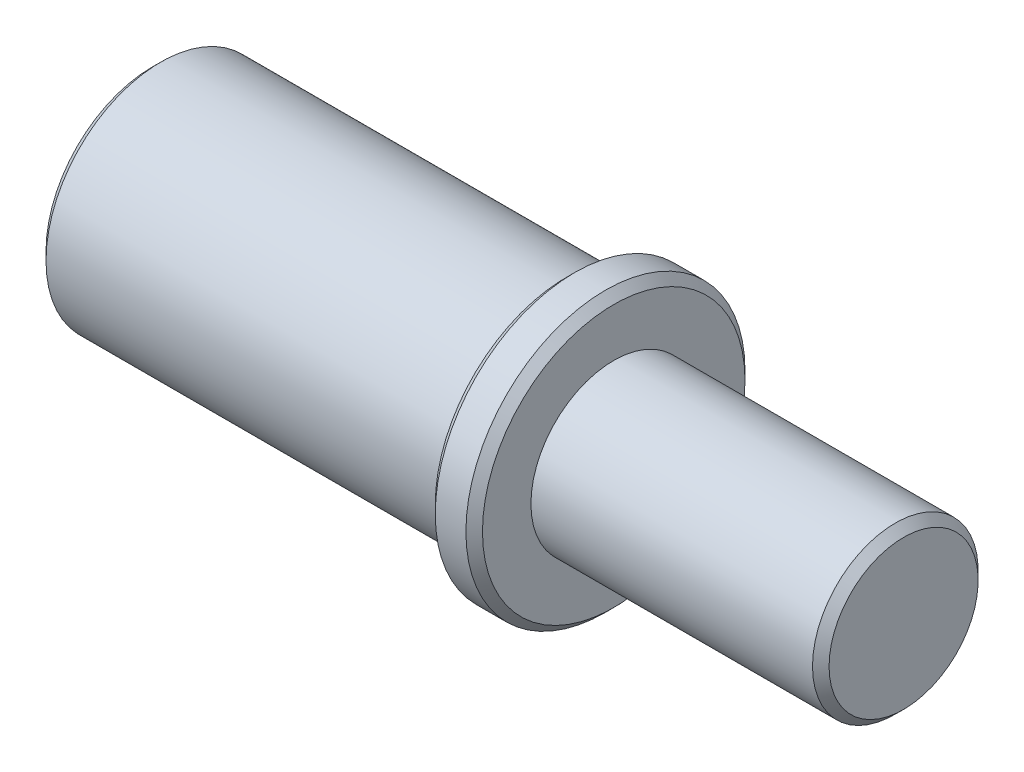
ISO-10303-21;
HEADER;
FILE_DESCRIPTION(('STEP AP214'),'2;1');
FILE_NAME('part.step','',(''),(''),'','','');
FILE_SCHEMA(('AUTOMOTIVE_DESIGN { 1 0 10303 214 1 1 1 1 }'));
ENDSEC;
DATA;
#1=APPLICATION_CONTEXT('core data for automotive mechanical design processes');
#2=APPLICATION_PROTOCOL_DEFINITION('international standard','automotive_design',2000,#1);
#3=PRODUCT_CONTEXT('',#1,'mechanical');
#4=PRODUCT('Part','Part','',(#3));
#5=PRODUCT_RELATED_PRODUCT_CATEGORY('part','',(#4));
#6=PRODUCT_DEFINITION_FORMATION('','',#4);
#7=PRODUCT_DEFINITION_CONTEXT('part definition',#1,'design');
#8=PRODUCT_DEFINITION('design','',#6,#7);
#9=PRODUCT_DEFINITION_SHAPE('','',#8);
#10=(LENGTH_UNIT() NAMED_UNIT(*) SI_UNIT(.MILLI.,.METRE.));
#11=(NAMED_UNIT(*) PLANE_ANGLE_UNIT() SI_UNIT($,.RADIAN.));
#12=(NAMED_UNIT(*) SI_UNIT($,.STERADIAN.) SOLID_ANGLE_UNIT());
#13=UNCERTAINTY_MEASURE_WITH_UNIT(LENGTH_MEASURE(1.E-05),#10,'distance_accuracy_value','');
#14=(GEOMETRIC_REPRESENTATION_CONTEXT(3) GLOBAL_UNCERTAINTY_ASSIGNED_CONTEXT((#13)) GLOBAL_UNIT_ASSIGNED_CONTEXT((#10,
#11,#12)) REPRESENTATION_CONTEXT('',''));
#15=CARTESIAN_POINT('',(0.,0.,0.));
#16=DIRECTION('',(0.,0.,1.));
#17=DIRECTION('',(1.,0.,0.));
#18=AXIS2_PLACEMENT_3D('',#15,#16,#17);
#19=CARTESIAN_POINT('',(0.,0.,0.));
#20=DIRECTION('',(1.,0.,0.));
#21=DIRECTION('',(0.,0.,-1.));
#22=AXIS2_PLACEMENT_3D('',#19,#20,#21);
#23=PLANE('',#22);
#24=CARTESIAN_POINT('',(0.,0.,0.));
#25=DIRECTION('',(1.,0.,0.));
#26=DIRECTION('',(0.,0.,-1.));
#27=AXIS2_PLACEMENT_3D('',#24,#25,#26);
#28=CIRCLE('',#27,12.85);
#29=CARTESIAN_POINT('',(0.,0.,-12.85));
#30=VERTEX_POINT('',#29);
#31=EDGE_CURVE('E84',#30,#30,#28,.F.);
#32=ORIENTED_EDGE('',*,*,#31,.T.);
#33=EDGE_LOOP('',(#32));
#34=FACE_BOUND('',#33,.T.);
#35=ADVANCED_FACE('F45',(#34),#23,.F.);
#36=CARTESIAN_POINT('',(0.,0.,0.));
#37=DIRECTION('',(-1.,0.,0.));
#38=DIRECTION('',(0.,0.,1.));
#39=AXIS2_PLACEMENT_3D('',#36,#37,#38);
#40=CYLINDRICAL_SURFACE('',#39,13.85);
#41=CARTESIAN_POINT('',(0.999999999999992,0.,0.));
#42=DIRECTION('',(1.,0.,0.));
#43=DIRECTION('',(0.,0.,-1.));
#44=AXIS2_PLACEMENT_3D('',#41,#42,#43);
#45=CIRCLE('',#44,13.85);
#46=CARTESIAN_POINT('',(0.999999999999992,0.,-13.85));
#47=VERTEX_POINT('',#46);
#48=EDGE_CURVE('E80',#47,#47,#45,.T.);
#49=ORIENTED_EDGE('',*,*,#48,.T.);
#50=EDGE_LOOP('',(#49));
#51=FACE_BOUND('',#50,.T.);
#52=CARTESIAN_POINT('',(50.,0.,0.));
#53=DIRECTION('',(-1.,0.,0.));
#54=DIRECTION('',(0.,0.,1.));
#55=AXIS2_PLACEMENT_3D('',#52,#53,#54);
#56=CIRCLE('',#55,13.85);
#57=CARTESIAN_POINT('',(50.,0.,13.85));
#58=VERTEX_POINT('',#57);
#59=EDGE_CURVE('E88',#58,#58,#56,.T.);
#60=ORIENTED_EDGE('',*,*,#59,.T.);
#61=EDGE_LOOP('',(#60));
#62=FACE_BOUND('',#61,.T.);
#63=ADVANCED_FACE('F115',(#51,#62),#40,.T.);
#64=CARTESIAN_POINT('',(50.,13.85,0.));
#65=DIRECTION('',(1.,0.,0.));
#66=DIRECTION('',(0.,0.,-1.));
#67=AXIS2_PLACEMENT_3D('',#64,#65,#66);
#68=PLANE('',#67);
#69=CARTESIAN_POINT('',(50.,0.,0.));
#70=DIRECTION('',(1.,0.,0.));
#71=DIRECTION('',(0.,0.,-1.));
#72=AXIS2_PLACEMENT_3D('',#69,#70,#71);
#73=CIRCLE('',#72,15.85);
#74=CARTESIAN_POINT('',(50.,0.,-15.85));
#75=VERTEX_POINT('',#74);
#76=EDGE_CURVE('E66',#75,#75,#73,.F.);
#77=ORIENTED_EDGE('',*,*,#76,.T.);
#78=EDGE_LOOP('',(#77));
#79=FACE_BOUND('',#78,.T.);
#80=ORIENTED_EDGE('',*,*,#59,.F.);
#81=EDGE_LOOP('',(#80));
#82=FACE_BOUND('',#81,.T.);
#83=ADVANCED_FACE('F121',(#79,#82),#68,.F.);
#84=CARTESIAN_POINT('',(0.,0.,0.));
#85=DIRECTION('',(-1.,0.,0.));
#86=DIRECTION('',(0.,0.,1.));
#87=AXIS2_PLACEMENT_3D('',#84,#85,#86);
#88=CYLINDRICAL_SURFACE('',#87,16.85);
#89=CARTESIAN_POINT('',(51.,0.,0.));
#90=DIRECTION('',(1.,0.,0.));
#91=DIRECTION('',(0.,0.,-1.));
#92=AXIS2_PLACEMENT_3D('',#89,#90,#91);
#93=CIRCLE('',#92,16.85);
#94=CARTESIAN_POINT('',(51.,0.,-16.85));
#95=VERTEX_POINT('',#94);
#96=EDGE_CURVE('E54',#95,#95,#93,.T.);
#97=ORIENTED_EDGE('',*,*,#96,.T.);
#98=EDGE_LOOP('',(#97));
#99=FACE_BOUND('',#98,.T.);
#100=CARTESIAN_POINT('',(54.7,0.,0.));
#101=DIRECTION('',(-1.,0.,0.));
#102=DIRECTION('',(0.,0.,1.));
#103=AXIS2_PLACEMENT_3D('',#100,#101,#102);
#104=CIRCLE('',#103,16.85);
#105=CARTESIAN_POINT('',(54.7,0.,16.85));
#106=VERTEX_POINT('',#105);
#107=EDGE_CURVE('E60',#106,#106,#104,.T.);
#108=ORIENTED_EDGE('',*,*,#107,.T.);
#109=EDGE_LOOP('',(#108));
#110=FACE_BOUND('',#109,.T.);
#111=ADVANCED_FACE('F112',(#99,#110),#88,.T.);
#112=CARTESIAN_POINT('',(55.7,16.85,0.));
#113=DIRECTION('',(-1.,0.,0.));
#114=DIRECTION('',(0.,0.,1.));
#115=AXIS2_PLACEMENT_3D('',#112,#113,#114);
#116=PLANE('',#115);
#117=CARTESIAN_POINT('',(55.7,0.,0.));
#118=DIRECTION('',(-1.,0.,0.));
#119=DIRECTION('',(0.,0.,1.));
#120=AXIS2_PLACEMENT_3D('',#117,#118,#119);
#121=CIRCLE('',#120,15.85);
#122=CARTESIAN_POINT('',(55.7,0.,15.85));
#123=VERTEX_POINT('',#122);
#124=EDGE_CURVE('E10',#123,#123,#121,.F.);
#125=ORIENTED_EDGE('',*,*,#124,.T.);
#126=EDGE_LOOP('',(#125));
#127=FACE_BOUND('',#126,.T.);
#128=CARTESIAN_POINT('',(55.7,0.,0.));
#129=DIRECTION('',(-1.,0.,0.));
#130=DIRECTION('',(0.,0.,1.));
#131=AXIS2_PLACEMENT_3D('',#128,#129,#130);
#132=CIRCLE('',#131,10.);
#133=CARTESIAN_POINT('',(55.7,0.,10.));
#134=VERTEX_POINT('',#133);
#135=EDGE_CURVE('E92',#134,#134,#132,.T.);
#136=ORIENTED_EDGE('',*,*,#135,.T.);
#137=EDGE_LOOP('',(#136));
#138=FACE_BOUND('',#137,.T.);
#139=ADVANCED_FACE('F98',(#127,#138),#116,.F.);
#140=CARTESIAN_POINT('',(0.,0.,0.));
#141=DIRECTION('',(-1.,0.,0.));
#142=DIRECTION('',(0.,0.,1.));
#143=AXIS2_PLACEMENT_3D('',#140,#141,#142);
#144=CYLINDRICAL_SURFACE('',#143,10.);
#145=CARTESIAN_POINT('',(89.7,0.,0.));
#146=DIRECTION('',(-1.,0.,0.));
#147=DIRECTION('',(0.,0.,1.));
#148=AXIS2_PLACEMENT_3D('',#145,#146,#147);
#149=CIRCLE('',#148,10.);
#150=CARTESIAN_POINT('',(89.7,0.,10.));
#151=VERTEX_POINT('',#150);
#152=EDGE_CURVE('E76',#151,#151,#149,.T.);
#153=ORIENTED_EDGE('',*,*,#152,.T.);
#154=EDGE_LOOP('',(#153));
#155=FACE_BOUND('',#154,.T.);
#156=ORIENTED_EDGE('',*,*,#135,.F.);
#157=EDGE_LOOP('',(#156));
#158=FACE_BOUND('',#157,.T.);
#159=ADVANCED_FACE('F100',(#155,#158),#144,.T.);
#160=CARTESIAN_POINT('',(90.7,10.,0.));
#161=DIRECTION('',(-1.,0.,0.));
#162=DIRECTION('',(0.,0.,1.));
#163=AXIS2_PLACEMENT_3D('',#160,#161,#162);
#164=PLANE('',#163);
#165=CARTESIAN_POINT('',(90.7,0.,0.));
#166=DIRECTION('',(-1.,0.,0.));
#167=DIRECTION('',(0.,0.,1.));
#168=AXIS2_PLACEMENT_3D('',#165,#166,#167);
#169=CIRCLE('',#168,8.99999999999997);
#170=CARTESIAN_POINT('',(90.7,0.,8.99999999999997));
#171=VERTEX_POINT('',#170);
#172=EDGE_CURVE('E72',#171,#171,#169,.F.);
#173=ORIENTED_EDGE('',*,*,#172,.T.);
#174=EDGE_LOOP('',(#173));
#175=FACE_BOUND('',#174,.T.);
#176=ADVANCED_FACE('F102',(#175),#164,.F.);
#177=CARTESIAN_POINT('',(0.,0.,0.));
#178=DIRECTION('',(1.,0.,0.));
#179=DIRECTION('',(0.,0.,-1.));
#180=AXIS2_PLACEMENT_3D('',#177,#178,#179);
#181=CONICAL_SURFACE('',#180,12.85,0.785398163397445);
#182=ORIENTED_EDGE('',*,*,#48,.F.);
#183=EDGE_LOOP('',(#182));
#184=FACE_BOUND('',#183,.T.);
#185=ORIENTED_EDGE('',*,*,#31,.F.);
#186=EDGE_LOOP('',(#185));
#187=FACE_BOUND('',#186,.T.);
#188=ADVANCED_FACE('F109',(#184,#187),#181,.T.);
#189=CARTESIAN_POINT('',(89.7,0.,0.));
#190=DIRECTION('',(-1.,0.,0.));
#191=DIRECTION('',(0.,0.,1.));
#192=AXIS2_PLACEMENT_3D('',#189,#190,#191);
#193=CONICAL_SURFACE('',#192,10.,0.785398163397451);
#194=ORIENTED_EDGE('',*,*,#172,.F.);
#195=EDGE_LOOP('',(#194));
#196=FACE_BOUND('',#195,.T.);
#197=ORIENTED_EDGE('',*,*,#152,.F.);
#198=EDGE_LOOP('',(#197));
#199=FACE_BOUND('',#198,.T.);
#200=ADVANCED_FACE('F132',(#196,#199),#193,.T.);
#201=CARTESIAN_POINT('',(50.,0.,0.));
#202=DIRECTION('',(1.,0.,0.));
#203=DIRECTION('',(0.,0.,-1.));
#204=AXIS2_PLACEMENT_3D('',#201,#202,#203);
#205=CONICAL_SURFACE('',#204,15.85,0.785398163397447);
#206=ORIENTED_EDGE('',*,*,#96,.F.);
#207=EDGE_LOOP('',(#206));
#208=FACE_BOUND('',#207,.T.);
#209=ORIENTED_EDGE('',*,*,#76,.F.);
#210=EDGE_LOOP('',(#209));
#211=FACE_BOUND('',#210,.T.);
#212=ADVANCED_FACE('F138',(#208,#211),#205,.T.);
#213=CARTESIAN_POINT('',(54.7,0.,0.));
#214=DIRECTION('',(-1.,0.,0.));
#215=DIRECTION('',(0.,0.,1.));
#216=AXIS2_PLACEMENT_3D('',#213,#214,#215);
#217=CONICAL_SURFACE('',#216,16.85,0.785398163397457);
#218=ORIENTED_EDGE('',*,*,#124,.F.);
#219=EDGE_LOOP('',(#218));
#220=FACE_BOUND('',#219,.T.);
#221=ORIENTED_EDGE('',*,*,#107,.F.);
#222=EDGE_LOOP('',(#221));
#223=FACE_BOUND('',#222,.T.);
#224=ADVANCED_FACE('F48',(#220,#223),#217,.T.);
#225=CLOSED_SHELL('',(#35,#63,#83,#111,#139,#159,#176,#188,#200,#212,#224));
#226=MANIFOLD_SOLID_BREP('B2',#225);
#227=ADVANCED_BREP_SHAPE_REPRESENTATION('',(#18,#226),#14);
#228=SHAPE_DEFINITION_REPRESENTATION(#9,#227);
ENDSEC;
END-ISO-10303-21;
